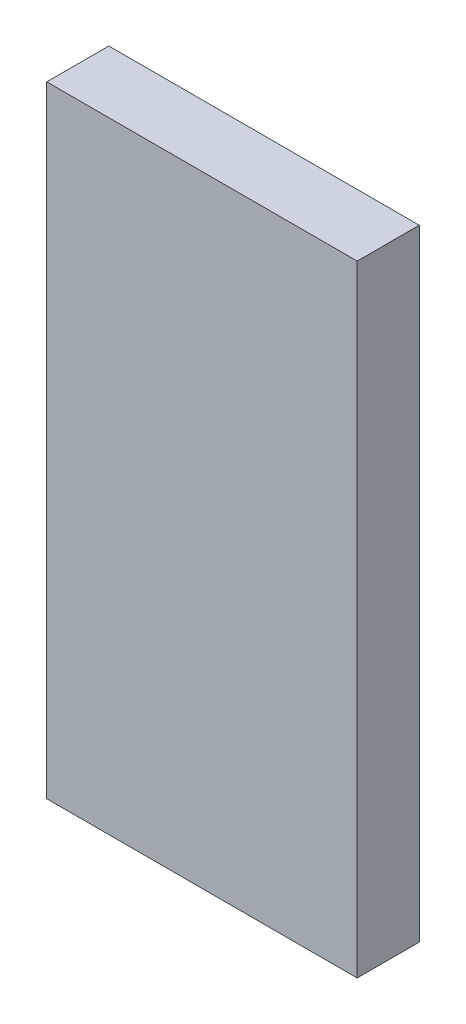
ISO-10303-21;
HEADER;
FILE_DESCRIPTION(('STEP AP214'),'2;1');
FILE_NAME('part.step','',(''),(''),'','','');
FILE_SCHEMA(('AUTOMOTIVE_DESIGN { 1 0 10303 214 1 1 1 1 }'));
ENDSEC;
DATA;
#1=APPLICATION_CONTEXT('core data for automotive mechanical design processes');
#2=APPLICATION_PROTOCOL_DEFINITION('international standard','automotive_design',2000,#1);
#3=PRODUCT_CONTEXT('',#1,'mechanical');
#4=PRODUCT('Part','Part','',(#3));
#5=PRODUCT_RELATED_PRODUCT_CATEGORY('part','',(#4));
#6=PRODUCT_DEFINITION_FORMATION('','',#4);
#7=PRODUCT_DEFINITION_CONTEXT('part definition',#1,'design');
#8=PRODUCT_DEFINITION('design','',#6,#7);
#9=PRODUCT_DEFINITION_SHAPE('','',#8);
#10=(LENGTH_UNIT() NAMED_UNIT(*) SI_UNIT(.MILLI.,.METRE.));
#11=(NAMED_UNIT(*) PLANE_ANGLE_UNIT() SI_UNIT($,.RADIAN.));
#12=(NAMED_UNIT(*) SI_UNIT($,.STERADIAN.) SOLID_ANGLE_UNIT());
#13=UNCERTAINTY_MEASURE_WITH_UNIT(LENGTH_MEASURE(1.E-05),#10,'distance_accuracy_value','');
#14=(GEOMETRIC_REPRESENTATION_CONTEXT(3) GLOBAL_UNCERTAINTY_ASSIGNED_CONTEXT((#13)) GLOBAL_UNIT_ASSIGNED_CONTEXT((#10,
#11,#12)) REPRESENTATION_CONTEXT('',''));
#15=CARTESIAN_POINT('',(0.,0.,0.));
#16=DIRECTION('',(0.,0.,1.));
#17=DIRECTION('',(1.,0.,0.));
#18=AXIS2_PLACEMENT_3D('',#15,#16,#17);
#19=CARTESIAN_POINT('',(-30.,0.,12.));
#20=DIRECTION('',(1.,0.,0.));
#21=DIRECTION('',(0.,0.,-1.));
#22=AXIS2_PLACEMENT_3D('',#19,#20,#21);
#23=PLANE('',#22);
#24=DIRECTION('',(0.,-1.,0.));
#25=VECTOR('',#24,1.);
#26=CARTESIAN_POINT('',(-30.,0.,0.));
#27=LINE('',#26,#25);
#28=CARTESIAN_POINT('',(-30.,120.,0.));
#29=VERTEX_POINT('',#28);
#30=CARTESIAN_POINT('',(-30.,0.,0.));
#31=VERTEX_POINT('',#30);
#32=EDGE_CURVE('E107',#29,#31,#27,.T.);
#33=ORIENTED_EDGE('',*,*,#32,.T.);
#34=DIRECTION('',(0.,0.,-1.));
#35=VECTOR('',#34,1.);
#36=CARTESIAN_POINT('',(-30.,0.,12.));
#37=LINE('',#36,#35);
#38=CARTESIAN_POINT('',(-30.,0.,12.));
#39=VERTEX_POINT('',#38);
#40=EDGE_CURVE('E11',#39,#31,#37,.T.);
#41=ORIENTED_EDGE('',*,*,#40,.F.);
#42=DIRECTION('',(0.,-1.,0.));
#43=VECTOR('',#42,1.);
#44=CARTESIAN_POINT('',(-30.,0.,12.));
#45=LINE('',#44,#43);
#46=CARTESIAN_POINT('',(-30.,120.,12.));
#47=VERTEX_POINT('',#46);
#48=EDGE_CURVE('E91',#47,#39,#45,.T.);
#49=ORIENTED_EDGE('',*,*,#48,.F.);
#50=DIRECTION('',(0.,0.,-1.));
#51=VECTOR('',#50,1.);
#52=CARTESIAN_POINT('',(-30.,120.,12.));
#53=LINE('',#52,#51);
#54=EDGE_CURVE('E103',#47,#29,#53,.T.);
#55=ORIENTED_EDGE('',*,*,#54,.T.);
#56=EDGE_LOOP('',(#33,#41,#49,#55));
#57=FACE_BOUND('',#56,.T.);
#58=ADVANCED_FACE('F39',(#57),#23,.F.);
#59=CARTESIAN_POINT('',(30.,0.,12.));
#60=DIRECTION('',(0.,1.,0.));
#61=DIRECTION('',(-1.,0.,0.));
#62=AXIS2_PLACEMENT_3D('',#59,#60,#61);
#63=PLANE('',#62);
#64=DIRECTION('',(1.,0.,0.));
#65=VECTOR('',#64,1.);
#66=CARTESIAN_POINT('',(30.,0.,0.));
#67=LINE('',#66,#65);
#68=CARTESIAN_POINT('',(30.,0.,0.));
#69=VERTEX_POINT('',#68);
#70=EDGE_CURVE('E96',#31,#69,#67,.T.);
#71=ORIENTED_EDGE('',*,*,#70,.T.);
#72=DIRECTION('',(0.,0.,-1.));
#73=VECTOR('',#72,1.);
#74=CARTESIAN_POINT('',(30.,0.,12.));
#75=LINE('',#74,#73);
#76=CARTESIAN_POINT('',(30.,0.,12.));
#77=VERTEX_POINT('',#76);
#78=EDGE_CURVE('E48',#77,#69,#75,.T.);
#79=ORIENTED_EDGE('',*,*,#78,.F.);
#80=DIRECTION('',(1.,0.,0.));
#81=VECTOR('',#80,1.);
#82=CARTESIAN_POINT('',(30.,0.,12.));
#83=LINE('',#82,#81);
#84=EDGE_CURVE('E86',#39,#77,#83,.T.);
#85=ORIENTED_EDGE('',*,*,#84,.F.);
#86=ORIENTED_EDGE('',*,*,#40,.T.);
#87=EDGE_LOOP('',(#71,#79,#85,#86));
#88=FACE_BOUND('',#87,.T.);
#89=ADVANCED_FACE('F95',(#88),#63,.F.);
#90=CARTESIAN_POINT('',(30.,0.,12.));
#91=DIRECTION('',(-1.,0.,0.));
#92=DIRECTION('',(0.,0.,1.));
#93=AXIS2_PLACEMENT_3D('',#90,#91,#92);
#94=PLANE('',#93);
#95=DIRECTION('',(0.,1.,0.));
#96=VECTOR('',#95,1.);
#97=CARTESIAN_POINT('',(30.,0.,0.));
#98=LINE('',#97,#96);
#99=CARTESIAN_POINT('',(30.,120.,0.));
#100=VERTEX_POINT('',#99);
#101=EDGE_CURVE('E73',#69,#100,#98,.T.);
#102=ORIENTED_EDGE('',*,*,#101,.T.);
#103=DIRECTION('',(0.,0.,-1.));
#104=VECTOR('',#103,1.);
#105=CARTESIAN_POINT('',(30.,120.,12.));
#106=LINE('',#105,#104);
#107=CARTESIAN_POINT('',(30.,120.,12.));
#108=VERTEX_POINT('',#107);
#109=EDGE_CURVE('E98',#108,#100,#106,.T.);
#110=ORIENTED_EDGE('',*,*,#109,.F.);
#111=DIRECTION('',(0.,1.,0.));
#112=VECTOR('',#111,1.);
#113=CARTESIAN_POINT('',(30.,0.,12.));
#114=LINE('',#113,#112);
#115=EDGE_CURVE('E89',#77,#108,#114,.T.);
#116=ORIENTED_EDGE('',*,*,#115,.F.);
#117=ORIENTED_EDGE('',*,*,#78,.T.);
#118=EDGE_LOOP('',(#102,#110,#116,#117));
#119=FACE_BOUND('',#118,.T.);
#120=ADVANCED_FACE('F99',(#119),#94,.F.);
#121=CARTESIAN_POINT('',(-30.,120.,12.));
#122=DIRECTION('',(0.,-1.,0.));
#123=DIRECTION('',(0.,0.,-1.));
#124=AXIS2_PLACEMENT_3D('',#121,#122,#123);
#125=PLANE('',#124);
#126=DIRECTION('',(-1.,0.,0.));
#127=VECTOR('',#126,1.);
#128=CARTESIAN_POINT('',(-30.,120.,0.));
#129=LINE('',#128,#127);
#130=EDGE_CURVE('E79',#100,#29,#129,.T.);
#131=ORIENTED_EDGE('',*,*,#130,.T.);
#132=ORIENTED_EDGE('',*,*,#54,.F.);
#133=DIRECTION('',(-1.,0.,0.));
#134=VECTOR('',#133,1.);
#135=CARTESIAN_POINT('',(-30.,120.,12.));
#136=LINE('',#135,#134);
#137=EDGE_CURVE('E56',#108,#47,#136,.T.);
#138=ORIENTED_EDGE('',*,*,#137,.F.);
#139=ORIENTED_EDGE('',*,*,#109,.T.);
#140=EDGE_LOOP('',(#131,#132,#138,#139));
#141=FACE_BOUND('',#140,.T.);
#142=ADVANCED_FACE('F120',(#141),#125,.F.);
#143=CARTESIAN_POINT('',(0.,0.,12.));
#144=DIRECTION('',(0.,0.,-1.));
#145=DIRECTION('',(-1.,0.,0.));
#146=AXIS2_PLACEMENT_3D('',#143,#144,#145);
#147=PLANE('',#146);
#148=ORIENTED_EDGE('',*,*,#48,.T.);
#149=ORIENTED_EDGE('',*,*,#84,.T.);
#150=ORIENTED_EDGE('',*,*,#115,.T.);
#151=ORIENTED_EDGE('',*,*,#137,.T.);
#152=EDGE_LOOP('',(#148,#149,#150,#151));
#153=FACE_BOUND('',#152,.T.);
#154=ADVANCED_FACE('F87',(#153),#147,.F.);
#155=CARTESIAN_POINT('',(0.,0.,0.));
#156=DIRECTION('',(0.,0.,-1.));
#157=DIRECTION('',(-1.,0.,0.));
#158=AXIS2_PLACEMENT_3D('',#155,#156,#157);
#159=PLANE('',#158);
#160=ORIENTED_EDGE('',*,*,#32,.F.);
#161=ORIENTED_EDGE('',*,*,#130,.F.);
#162=ORIENTED_EDGE('',*,*,#101,.F.);
#163=ORIENTED_EDGE('',*,*,#70,.F.);
#164=EDGE_LOOP('',(#160,#161,#162,#163));
#165=FACE_BOUND('',#164,.T.);
#166=ADVANCED_FACE('F123',(#165),#159,.T.);
#167=CLOSED_SHELL('',(#58,#89,#120,#142,#154,#166));
#168=MANIFOLD_SOLID_BREP('B2',#167);
#169=ADVANCED_BREP_SHAPE_REPRESENTATION('',(#18,#168),#14);
#170=SHAPE_DEFINITION_REPRESENTATION(#9,#169);
ENDSEC;
END-ISO-10303-21;
